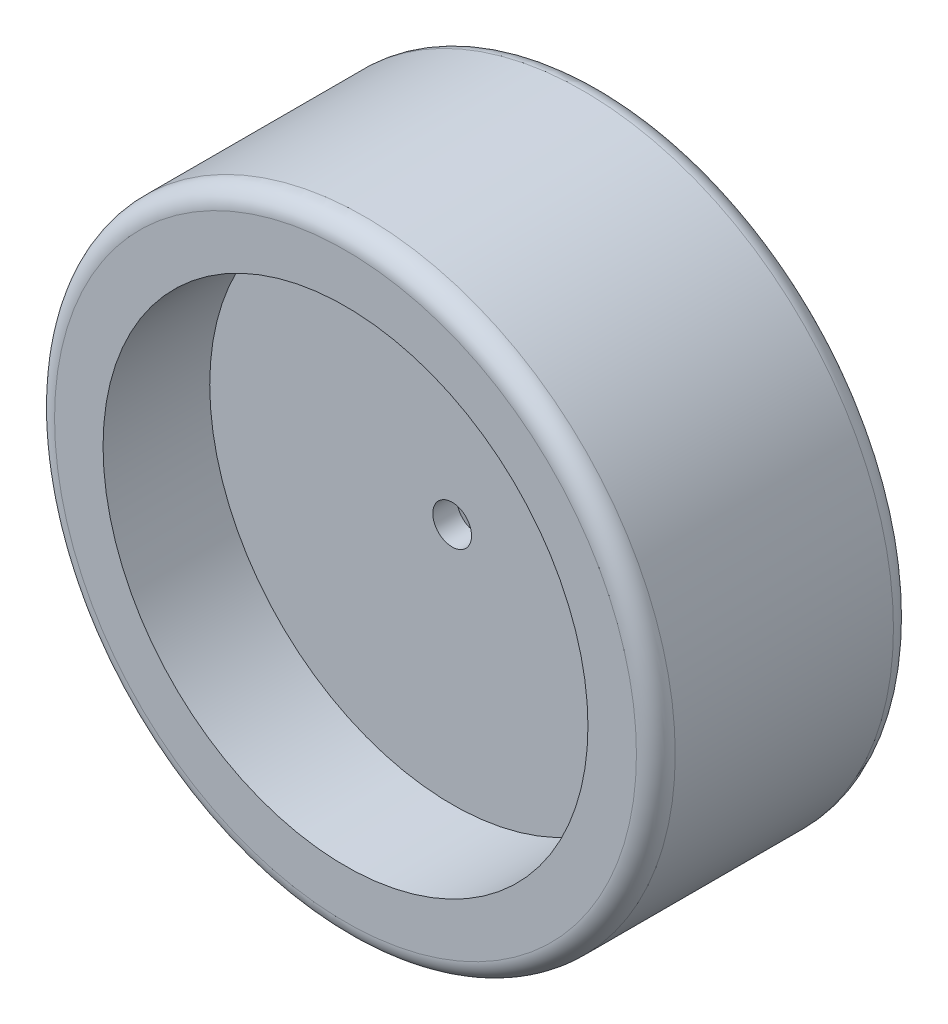
ISO-10303-21;
HEADER;
FILE_DESCRIPTION(('STEP AP214'),'2;1');
FILE_NAME('part.step','',(''),(''),'','','');
FILE_SCHEMA(('AUTOMOTIVE_DESIGN { 1 0 10303 214 1 1 1 1 }'));
ENDSEC;
DATA;
#1=APPLICATION_CONTEXT('core data for automotive mechanical design processes');
#2=APPLICATION_PROTOCOL_DEFINITION('international standard','automotive_design',2000,#1);
#3=PRODUCT_CONTEXT('',#1,'mechanical');
#4=PRODUCT('Part','Part','',(#3));
#5=PRODUCT_RELATED_PRODUCT_CATEGORY('part','',(#4));
#6=PRODUCT_DEFINITION_FORMATION('','',#4);
#7=PRODUCT_DEFINITION_CONTEXT('part definition',#1,'design');
#8=PRODUCT_DEFINITION('design','',#6,#7);
#9=PRODUCT_DEFINITION_SHAPE('','',#8);
#10=(LENGTH_UNIT() NAMED_UNIT(*) SI_UNIT(.MILLI.,.METRE.));
#11=(NAMED_UNIT(*) PLANE_ANGLE_UNIT() SI_UNIT($,.RADIAN.));
#12=(NAMED_UNIT(*) SI_UNIT($,.STERADIAN.) SOLID_ANGLE_UNIT());
#13=UNCERTAINTY_MEASURE_WITH_UNIT(LENGTH_MEASURE(1.E-05),#10,'distance_accuracy_value','');
#14=(GEOMETRIC_REPRESENTATION_CONTEXT(3) GLOBAL_UNCERTAINTY_ASSIGNED_CONTEXT((#13)) GLOBAL_UNIT_ASSIGNED_CONTEXT((#10,
#11,#12)) REPRESENTATION_CONTEXT('',''));
#15=CARTESIAN_POINT('',(0.,0.,0.));
#16=DIRECTION('',(0.,0.,1.));
#17=DIRECTION('',(1.,0.,0.));
#18=AXIS2_PLACEMENT_3D('',#15,#16,#17);
#19=CARTESIAN_POINT('',(0.,0.,1.));
#20=DIRECTION('',(0.,0.,1.));
#21=DIRECTION('',(1.,0.,0.));
#22=AXIS2_PLACEMENT_3D('',#19,#20,#21);
#23=PLANE('',#22);
#24=CARTESIAN_POINT('',(0.,0.,1.));
#25=DIRECTION('',(0.,0.,1.));
#26=DIRECTION('',(1.,0.,0.));
#27=AXIS2_PLACEMENT_3D('',#24,#25,#26);
#28=CIRCLE('',#27,25.);
#29=CARTESIAN_POINT('',(25.,0.,1.));
#30=VERTEX_POINT('',#29);
#31=EDGE_CURVE('E119',#30,#30,#28,.T.);
#32=ORIENTED_EDGE('',*,*,#31,.F.);
#33=EDGE_LOOP('',(#32));
#34=FACE_BOUND('',#33,.T.);
#35=DIRECTION('',(-0.5,0.866025403784438,0.));
#36=VECTOR('',#35,1.);
#37=CARTESIAN_POINT('',(6.92820323027551,0.,1.));
#38=LINE('',#37,#36);
#39=CARTESIAN_POINT('',(6.92820323027551,0.,1.));
#40=VERTEX_POINT('',#39);
#41=CARTESIAN_POINT('',(3.46410161513776,6.,1.));
#42=VERTEX_POINT('',#41);
#43=EDGE_CURVE('E48',#40,#42,#38,.T.);
#44=ORIENTED_EDGE('',*,*,#43,.T.);
#45=DIRECTION('',(-1.,0.,0.));
#46=VECTOR('',#45,1.);
#47=CARTESIAN_POINT('',(3.46410161513776,6.,1.));
#48=LINE('',#47,#46);
#49=CARTESIAN_POINT('',(-3.46410161513776,6.,1.));
#50=VERTEX_POINT('',#49);
#51=EDGE_CURVE('E104',#42,#50,#48,.T.);
#52=ORIENTED_EDGE('',*,*,#51,.T.);
#53=DIRECTION('',(-0.5,-0.866025403784438,0.));
#54=VECTOR('',#53,1.);
#55=CARTESIAN_POINT('',(-3.46410161513776,6.,1.));
#56=LINE('',#55,#54);
#57=CARTESIAN_POINT('',(-6.92820323027551,0.,1.));
#58=VERTEX_POINT('',#57);
#59=EDGE_CURVE('E102',#50,#58,#56,.T.);
#60=ORIENTED_EDGE('',*,*,#59,.T.);
#61=DIRECTION('',(0.5,-0.866025403784439,0.));
#62=VECTOR('',#61,1.);
#63=CARTESIAN_POINT('',(-6.92820323027551,0.,1.));
#64=LINE('',#63,#62);
#65=CARTESIAN_POINT('',(-3.46410161513776,-6.,1.));
#66=VERTEX_POINT('',#65);
#67=EDGE_CURVE('E83',#58,#66,#64,.T.);
#68=ORIENTED_EDGE('',*,*,#67,.T.);
#69=DIRECTION('',(1.,0.,0.));
#70=VECTOR('',#69,1.);
#71=CARTESIAN_POINT('',(-3.46410161513776,-6.,1.));
#72=LINE('',#71,#70);
#73=CARTESIAN_POINT('',(3.46410161513776,-6.,1.));
#74=VERTEX_POINT('',#73);
#75=EDGE_CURVE('E92',#66,#74,#72,.T.);
#76=ORIENTED_EDGE('',*,*,#75,.T.);
#77=DIRECTION('',(0.5,0.866025403784439,0.));
#78=VECTOR('',#77,1.);
#79=CARTESIAN_POINT('',(3.46410161513776,-6.,1.));
#80=LINE('',#79,#78);
#81=EDGE_CURVE('E98',#74,#40,#80,.T.);
#82=ORIENTED_EDGE('',*,*,#81,.T.);
#83=EDGE_LOOP('',(#44,#52,#60,#68,#76,#82));
#84=FACE_BOUND('',#83,.T.);
#85=ADVANCED_FACE('F33',(#34,#84),#23,.F.);
#86=CARTESIAN_POINT('',(6.92820323027551,0.,5.));
#87=DIRECTION('',(-0.866025403784439,-0.5,0.));
#88=DIRECTION('',(0.5,-0.866025403784438,0.));
#89=AXIS2_PLACEMENT_3D('',#86,#87,#88);
#90=PLANE('',#89);
#91=ORIENTED_EDGE('',*,*,#43,.F.);
#92=DIRECTION('',(0.,0.,-1.));
#93=VECTOR('',#92,1.);
#94=CARTESIAN_POINT('',(6.92820323027551,0.,5.));
#95=LINE('',#94,#93);
#96=CARTESIAN_POINT('',(6.92820323027551,0.,5.));
#97=VERTEX_POINT('',#96);
#98=EDGE_CURVE('E110',#97,#40,#95,.T.);
#99=ORIENTED_EDGE('',*,*,#98,.F.);
#100=DIRECTION('',(-0.5,0.866025403784438,0.));
#101=VECTOR('',#100,1.);
#102=CARTESIAN_POINT('',(6.92820323027551,0.,5.));
#103=LINE('',#102,#101);
#104=CARTESIAN_POINT('',(3.46410161513776,6.,5.));
#105=VERTEX_POINT('',#104);
#106=EDGE_CURVE('E109',#97,#105,#103,.T.);
#107=ORIENTED_EDGE('',*,*,#106,.T.);
#108=DIRECTION('',(0.,0.,-1.));
#109=VECTOR('',#108,1.);
#110=CARTESIAN_POINT('',(3.46410161513776,6.,5.));
#111=LINE('',#110,#109);
#112=EDGE_CURVE('E117',#105,#42,#111,.T.);
#113=ORIENTED_EDGE('',*,*,#112,.T.);
#114=EDGE_LOOP('',(#91,#99,#107,#113));
#115=FACE_BOUND('',#114,.T.);
#116=ADVANCED_FACE('F188',(#115),#90,.T.);
#117=CARTESIAN_POINT('',(3.46410161513776,6.,5.));
#118=DIRECTION('',(0.,-1.,0.));
#119=DIRECTION('',(0.,0.,-1.));
#120=AXIS2_PLACEMENT_3D('',#117,#118,#119);
#121=PLANE('',#120);
#122=ORIENTED_EDGE('',*,*,#51,.F.);
#123=ORIENTED_EDGE('',*,*,#112,.F.);
#124=DIRECTION('',(-1.,0.,0.));
#125=VECTOR('',#124,1.);
#126=CARTESIAN_POINT('',(3.46410161513776,6.,5.));
#127=LINE('',#126,#125);
#128=CARTESIAN_POINT('',(-3.46410161513776,6.,5.));
#129=VERTEX_POINT('',#128);
#130=EDGE_CURVE('E174',#105,#129,#127,.T.);
#131=ORIENTED_EDGE('',*,*,#130,.T.);
#132=DIRECTION('',(0.,0.,-1.));
#133=VECTOR('',#132,1.);
#134=CARTESIAN_POINT('',(-3.46410161513776,6.,5.));
#135=LINE('',#134,#133);
#136=EDGE_CURVE('E115',#129,#50,#135,.T.);
#137=ORIENTED_EDGE('',*,*,#136,.T.);
#138=EDGE_LOOP('',(#122,#123,#131,#137));
#139=FACE_BOUND('',#138,.T.);
#140=ADVANCED_FACE('F186',(#139),#121,.T.);
#141=CARTESIAN_POINT('',(-3.46410161513776,6.,5.));
#142=DIRECTION('',(0.866025403784439,-0.5,0.));
#143=DIRECTION('',(0.5,0.866025403784438,0.));
#144=AXIS2_PLACEMENT_3D('',#141,#142,#143);
#145=PLANE('',#144);
#146=ORIENTED_EDGE('',*,*,#59,.F.);
#147=ORIENTED_EDGE('',*,*,#136,.F.);
#148=DIRECTION('',(-0.5,-0.866025403784438,0.));
#149=VECTOR('',#148,1.);
#150=CARTESIAN_POINT('',(-3.46410161513776,6.,5.));
#151=LINE('',#150,#149);
#152=CARTESIAN_POINT('',(-6.92820323027551,0.,5.));
#153=VERTEX_POINT('',#152);
#154=EDGE_CURVE('E177',#129,#153,#151,.T.);
#155=ORIENTED_EDGE('',*,*,#154,.T.);
#156=DIRECTION('',(0.,0.,-1.));
#157=VECTOR('',#156,1.);
#158=CARTESIAN_POINT('',(-6.92820323027551,0.,5.));
#159=LINE('',#158,#157);
#160=EDGE_CURVE('E88',#153,#58,#159,.T.);
#161=ORIENTED_EDGE('',*,*,#160,.T.);
#162=EDGE_LOOP('',(#146,#147,#155,#161));
#163=FACE_BOUND('',#162,.T.);
#164=ADVANCED_FACE('F203',(#163),#145,.T.);
#165=CARTESIAN_POINT('',(-6.92820323027551,0.,5.));
#166=DIRECTION('',(0.866025403784439,0.5,0.));
#167=DIRECTION('',(-0.5,0.866025403784439,0.));
#168=AXIS2_PLACEMENT_3D('',#165,#166,#167);
#169=PLANE('',#168);
#170=ORIENTED_EDGE('',*,*,#67,.F.);
#171=ORIENTED_EDGE('',*,*,#160,.F.);
#172=DIRECTION('',(0.5,-0.866025403784439,0.));
#173=VECTOR('',#172,1.);
#174=CARTESIAN_POINT('',(-6.92820323027551,0.,5.));
#175=LINE('',#174,#173);
#176=CARTESIAN_POINT('',(-3.46410161513776,-6.,5.));
#177=VERTEX_POINT('',#176);
#178=EDGE_CURVE('E57',#153,#177,#175,.T.);
#179=ORIENTED_EDGE('',*,*,#178,.T.);
#180=DIRECTION('',(0.,0.,-1.));
#181=VECTOR('',#180,1.);
#182=CARTESIAN_POINT('',(-3.46410161513776,-6.,5.));
#183=LINE('',#182,#181);
#184=EDGE_CURVE('E78',#177,#66,#183,.T.);
#185=ORIENTED_EDGE('',*,*,#184,.T.);
#186=EDGE_LOOP('',(#170,#171,#179,#185));
#187=FACE_BOUND('',#186,.T.);
#188=ADVANCED_FACE('F80',(#187),#169,.T.);
#189=CARTESIAN_POINT('',(-3.46410161513776,-6.,5.));
#190=DIRECTION('',(0.,1.,0.));
#191=DIRECTION('',(0.,0.,1.));
#192=AXIS2_PLACEMENT_3D('',#189,#190,#191);
#193=PLANE('',#192);
#194=ORIENTED_EDGE('',*,*,#75,.F.);
#195=ORIENTED_EDGE('',*,*,#184,.F.);
#196=DIRECTION('',(1.,0.,0.));
#197=VECTOR('',#196,1.);
#198=CARTESIAN_POINT('',(-3.46410161513776,-6.,5.));
#199=LINE('',#198,#197);
#200=CARTESIAN_POINT('',(3.46410161513776,-6.,5.));
#201=VERTEX_POINT('',#200);
#202=EDGE_CURVE('E180',#177,#201,#199,.T.);
#203=ORIENTED_EDGE('',*,*,#202,.T.);
#204=DIRECTION('',(0.,0.,-1.));
#205=VECTOR('',#204,1.);
#206=CARTESIAN_POINT('',(3.46410161513776,-6.,5.));
#207=LINE('',#206,#205);
#208=EDGE_CURVE('E89',#201,#74,#207,.T.);
#209=ORIENTED_EDGE('',*,*,#208,.T.);
#210=EDGE_LOOP('',(#194,#195,#203,#209));
#211=FACE_BOUND('',#210,.T.);
#212=ADVANCED_FACE('F93',(#211),#193,.T.);
#213=CARTESIAN_POINT('',(3.46410161513776,-6.,5.));
#214=DIRECTION('',(-0.866025403784439,0.5,0.));
#215=DIRECTION('',(-0.5,-0.866025403784439,0.));
#216=AXIS2_PLACEMENT_3D('',#213,#214,#215);
#217=PLANE('',#216);
#218=ORIENTED_EDGE('',*,*,#81,.F.);
#219=ORIENTED_EDGE('',*,*,#208,.F.);
#220=DIRECTION('',(0.5,0.866025403784439,0.));
#221=VECTOR('',#220,1.);
#222=CARTESIAN_POINT('',(3.46410161513776,-6.,5.));
#223=LINE('',#222,#221);
#224=EDGE_CURVE('E112',#201,#97,#223,.T.);
#225=ORIENTED_EDGE('',*,*,#224,.T.);
#226=ORIENTED_EDGE('',*,*,#98,.T.);
#227=EDGE_LOOP('',(#218,#219,#225,#226));
#228=FACE_BOUND('',#227,.T.);
#229=ADVANCED_FACE('F197',(#228),#217,.T.);
#230=CARTESIAN_POINT('',(0.,0.,7.5));
#231=DIRECTION('',(0.,0.,1.));
#232=DIRECTION('',(1.,0.,0.));
#233=AXIS2_PLACEMENT_3D('',#230,#231,#232);
#234=PLANE('',#233);
#235=CARTESIAN_POINT('',(0.,0.,7.5));
#236=DIRECTION('',(0.,0.,1.));
#237=DIRECTION('',(1.,0.,0.));
#238=AXIS2_PLACEMENT_3D('',#235,#236,#237);
#239=CIRCLE('',#238,25.);
#240=CARTESIAN_POINT('',(25.,0.,7.5));
#241=VERTEX_POINT('',#240);
#242=EDGE_CURVE('E161',#241,#241,#239,.T.);
#243=ORIENTED_EDGE('',*,*,#242,.T.);
#244=EDGE_LOOP('',(#243));
#245=FACE_BOUND('',#244,.T.);
#246=CARTESIAN_POINT('',(0.,0.,7.5));
#247=DIRECTION('',(0.,0.,1.));
#248=DIRECTION('',(1.,0.,0.));
#249=AXIS2_PLACEMENT_3D('',#246,#247,#248);
#250=CIRCLE('',#249,2.);
#251=CARTESIAN_POINT('',(2.,0.,7.5));
#252=VERTEX_POINT('',#251);
#253=EDGE_CURVE('E167',#252,#252,#250,.T.);
#254=ORIENTED_EDGE('',*,*,#253,.F.);
#255=EDGE_LOOP('',(#254));
#256=FACE_BOUND('',#255,.T.);
#257=ADVANCED_FACE('F238',(#245,#256),#234,.T.);
#258=CARTESIAN_POINT('',(0.,0.,5.));
#259=DIRECTION('',(0.,0.,1.));
#260=DIRECTION('',(1.,0.,0.));
#261=AXIS2_PLACEMENT_3D('',#258,#259,#260);
#262=PLANE('',#261);
#263=ORIENTED_EDGE('',*,*,#130,.F.);
#264=ORIENTED_EDGE('',*,*,#106,.F.);
#265=ORIENTED_EDGE('',*,*,#224,.F.);
#266=ORIENTED_EDGE('',*,*,#202,.F.);
#267=ORIENTED_EDGE('',*,*,#178,.F.);
#268=ORIENTED_EDGE('',*,*,#154,.F.);
#269=EDGE_LOOP('',(#263,#264,#265,#266,#267,#268));
#270=FACE_BOUND('',#269,.T.);
#271=CARTESIAN_POINT('',(0.,0.,5.));
#272=DIRECTION('',(0.,0.,1.));
#273=DIRECTION('',(1.,0.,0.));
#274=AXIS2_PLACEMENT_3D('',#271,#272,#273);
#275=CIRCLE('',#274,2.);
#276=CARTESIAN_POINT('',(2.,0.,5.));
#277=VERTEX_POINT('',#276);
#278=EDGE_CURVE('E166',#277,#277,#275,.T.);
#279=ORIENTED_EDGE('',*,*,#278,.T.);
#280=EDGE_LOOP('',(#279));
#281=FACE_BOUND('',#280,.T.);
#282=ADVANCED_FACE('F193',(#270,#281),#262,.F.);
#283=CARTESIAN_POINT('',(0.,0.,7.5));
#284=DIRECTION('',(0.,0.,-1.));
#285=DIRECTION('',(-1.,0.,0.));
#286=AXIS2_PLACEMENT_3D('',#283,#284,#285);
#287=CYLINDRICAL_SURFACE('',#286,2.);
#288=ORIENTED_EDGE('',*,*,#253,.T.);
#289=EDGE_LOOP('',(#288));
#290=FACE_BOUND('',#289,.T.);
#291=ORIENTED_EDGE('',*,*,#278,.F.);
#292=EDGE_LOOP('',(#291));
#293=FACE_BOUND('',#292,.T.);
#294=ADVANCED_FACE('F222',(#290,#293),#287,.F.);
#295=CARTESIAN_POINT('',(0.,0.,-8.));
#296=DIRECTION('',(0.,0.,1.));
#297=DIRECTION('',(1.,0.,0.));
#298=AXIS2_PLACEMENT_3D('',#295,#296,#297);
#299=CYLINDRICAL_SURFACE('',#298,25.);
#300=CARTESIAN_POINT('',(0.,0.,-8.));
#301=DIRECTION('',(0.,0.,1.));
#302=DIRECTION('',(1.,0.,0.));
#303=AXIS2_PLACEMENT_3D('',#300,#301,#302);
#304=CIRCLE('',#303,25.);
#305=CARTESIAN_POINT('',(25.,0.,-8.));
#306=VERTEX_POINT('',#305);
#307=EDGE_CURVE('E158',#306,#306,#304,.T.);
#308=ORIENTED_EDGE('',*,*,#307,.F.);
#309=EDGE_LOOP('',(#308));
#310=FACE_BOUND('',#309,.T.);
#311=ORIENTED_EDGE('',*,*,#31,.T.);
#312=EDGE_LOOP('',(#311));
#313=FACE_BOUND('',#312,.T.);
#314=ADVANCED_FACE('F142',(#310,#313),#299,.F.);
#315=CARTESIAN_POINT('',(0.,0.,-8.));
#316=DIRECTION('',(0.,0.,1.));
#317=DIRECTION('',(1.,0.,0.));
#318=AXIS2_PLACEMENT_3D('',#315,#316,#317);
#319=CYLINDRICAL_SURFACE('',#318,32.);
#320=CARTESIAN_POINT('',(0.,0.,-6.));
#321=DIRECTION('',(0.,0.,1.));
#322=DIRECTION('',(1.,0.,0.));
#323=AXIS2_PLACEMENT_3D('',#320,#321,#322);
#324=CIRCLE('',#323,32.);
#325=CARTESIAN_POINT('',(32.,0.,-6.));
#326=VERTEX_POINT('',#325);
#327=EDGE_CURVE('E125',#326,#326,#324,.T.);
#328=ORIENTED_EDGE('',*,*,#327,.T.);
#329=EDGE_LOOP('',(#328));
#330=FACE_BOUND('',#329,.T.);
#331=CARTESIAN_POINT('',(0.,0.,16.5));
#332=DIRECTION('',(0.,0.,1.));
#333=DIRECTION('',(1.,0.,0.));
#334=AXIS2_PLACEMENT_3D('',#331,#332,#333);
#335=CIRCLE('',#334,32.);
#336=CARTESIAN_POINT('',(32.,0.,16.5));
#337=VERTEX_POINT('',#336);
#338=EDGE_CURVE('E122',#337,#337,#335,.F.);
#339=ORIENTED_EDGE('',*,*,#338,.T.);
#340=EDGE_LOOP('',(#339));
#341=FACE_BOUND('',#340,.T.);
#342=ADVANCED_FACE('F139',(#330,#341),#319,.T.);
#343=CARTESIAN_POINT('',(0.,0.,-8.));
#344=DIRECTION('',(0.,0.,1.));
#345=DIRECTION('',(1.,0.,0.));
#346=AXIS2_PLACEMENT_3D('',#343,#344,#345);
#347=PLANE('',#346);
#348=CARTESIAN_POINT('',(0.,0.,-8.));
#349=DIRECTION('',(0.,0.,1.));
#350=DIRECTION('',(1.,0.,0.));
#351=AXIS2_PLACEMENT_3D('',#348,#349,#350);
#352=CIRCLE('',#351,30.);
#353=CARTESIAN_POINT('',(30.,0.,-8.));
#354=VERTEX_POINT('',#353);
#355=EDGE_CURVE('E41',#354,#354,#352,.F.);
#356=ORIENTED_EDGE('',*,*,#355,.T.);
#357=EDGE_LOOP('',(#356));
#358=FACE_BOUND('',#357,.T.);
#359=ORIENTED_EDGE('',*,*,#307,.T.);
#360=EDGE_LOOP('',(#359));
#361=FACE_BOUND('',#360,.T.);
#362=ADVANCED_FACE('F130',(#358,#361),#347,.F.);
#363=CARTESIAN_POINT('',(0.,0.,18.5));
#364=DIRECTION('',(0.,0.,1.));
#365=DIRECTION('',(1.,0.,0.));
#366=AXIS2_PLACEMENT_3D('',#363,#364,#365);
#367=PLANE('',#366);
#368=CARTESIAN_POINT('',(0.,0.,18.5));
#369=DIRECTION('',(0.,0.,1.));
#370=DIRECTION('',(1.,0.,0.));
#371=AXIS2_PLACEMENT_3D('',#368,#369,#370);
#372=CIRCLE('',#371,30.);
#373=CARTESIAN_POINT('',(30.,0.,18.5));
#374=VERTEX_POINT('',#373);
#375=EDGE_CURVE('E11',#374,#374,#372,.T.);
#376=ORIENTED_EDGE('',*,*,#375,.T.);
#377=EDGE_LOOP('',(#376));
#378=FACE_BOUND('',#377,.T.);
#379=CARTESIAN_POINT('',(0.,0.,18.5));
#380=DIRECTION('',(0.,0.,1.));
#381=DIRECTION('',(1.,0.,0.));
#382=AXIS2_PLACEMENT_3D('',#379,#380,#381);
#383=CIRCLE('',#382,25.);
#384=CARTESIAN_POINT('',(25.,0.,18.5));
#385=VERTEX_POINT('',#384);
#386=EDGE_CURVE('E156',#385,#385,#383,.T.);
#387=ORIENTED_EDGE('',*,*,#386,.F.);
#388=EDGE_LOOP('',(#387));
#389=FACE_BOUND('',#388,.T.);
#390=ADVANCED_FACE('F150',(#378,#389),#367,.T.);
#391=ORIENTED_EDGE('',*,*,#242,.F.);
#392=EDGE_LOOP('',(#391));
#393=FACE_BOUND('',#392,.T.);
#394=ORIENTED_EDGE('',*,*,#386,.T.);
#395=EDGE_LOOP('',(#394));
#396=FACE_BOUND('',#395,.T.);
#397=ADVANCED_FACE('F136',(#393,#396),#299,.F.);
#398=CARTESIAN_POINT('',(0.,0.,-6.));
#399=DIRECTION('',(0.,0.,1.));
#400=DIRECTION('',(1.,0.,0.));
#401=AXIS2_PLACEMENT_3D('',#398,#399,#400);
#402=TOROIDAL_SURFACE('',#401,30.,2.);
#403=ORIENTED_EDGE('',*,*,#355,.F.);
#404=EDGE_LOOP('',(#403));
#405=FACE_BOUND('',#404,.T.);
#406=ORIENTED_EDGE('',*,*,#327,.F.);
#407=EDGE_LOOP('',(#406));
#408=FACE_BOUND('',#407,.T.);
#409=ADVANCED_FACE('F133',(#405,#408),#402,.T.);
#410=CARTESIAN_POINT('',(0.,0.,16.5));
#411=DIRECTION('',(0.,0.,1.));
#412=DIRECTION('',(1.,0.,0.));
#413=AXIS2_PLACEMENT_3D('',#410,#411,#412);
#414=TOROIDAL_SURFACE('',#413,30.,2.);
#415=ORIENTED_EDGE('',*,*,#338,.F.);
#416=EDGE_LOOP('',(#415));
#417=FACE_BOUND('',#416,.T.);
#418=ORIENTED_EDGE('',*,*,#375,.F.);
#419=EDGE_LOOP('',(#418));
#420=FACE_BOUND('',#419,.T.);
#421=ADVANCED_FACE('F35',(#417,#420),#414,.T.);
#422=CLOSED_SHELL('',(#85,#116,#140,#164,#188,#212,#229,#257,#282,#294,#314,#342,#362,#390,#397,
#409,#421));
#423=MANIFOLD_SOLID_BREP('B2',#422);
#424=ADVANCED_BREP_SHAPE_REPRESENTATION('',(#18,#423),#14);
#425=SHAPE_DEFINITION_REPRESENTATION(#9,#424);
ENDSEC;
END-ISO-10303-21;
